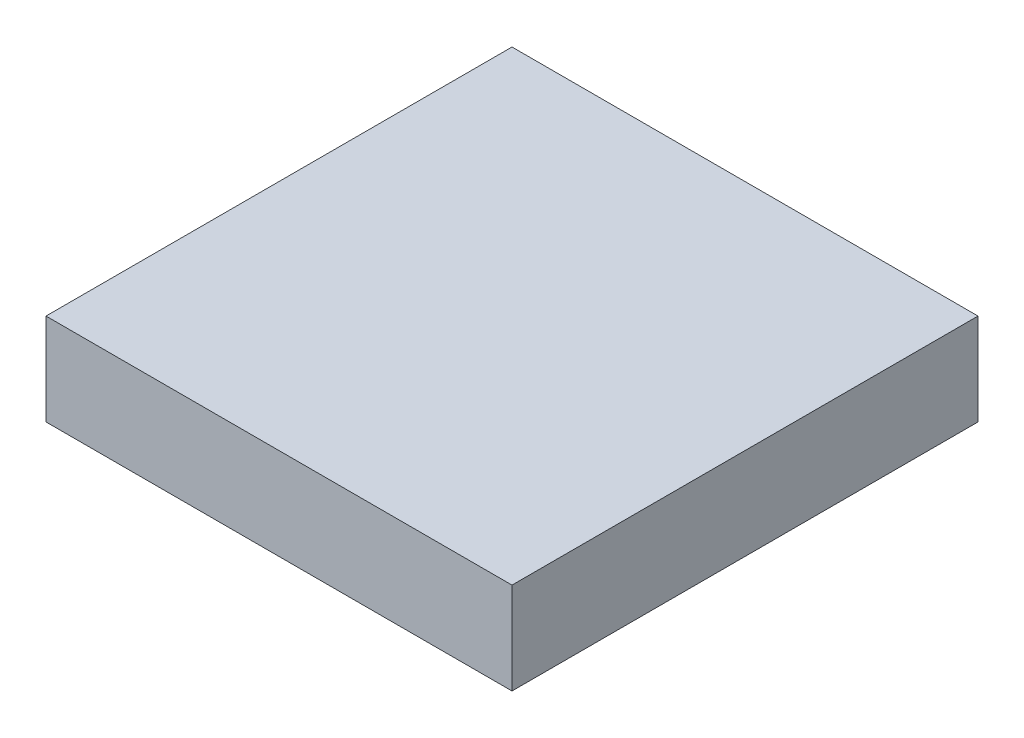
ISO-10303-21;
HEADER;
FILE_DESCRIPTION(('STEP AP214'),'2;1');
FILE_NAME('part.step','',(''),(''),'','','');
FILE_SCHEMA(('AUTOMOTIVE_DESIGN { 1 0 10303 214 1 1 1 1 }'));
ENDSEC;
DATA;
#1=APPLICATION_CONTEXT('core data for automotive mechanical design processes');
#2=APPLICATION_PROTOCOL_DEFINITION('international standard','automotive_design',2000,#1);
#3=PRODUCT_CONTEXT('',#1,'mechanical');
#4=PRODUCT('Part','Part','',(#3));
#5=PRODUCT_RELATED_PRODUCT_CATEGORY('part','',(#4));
#6=PRODUCT_DEFINITION_FORMATION('','',#4);
#7=PRODUCT_DEFINITION_CONTEXT('part definition',#1,'design');
#8=PRODUCT_DEFINITION('design','',#6,#7);
#9=PRODUCT_DEFINITION_SHAPE('','',#8);
#10=(LENGTH_UNIT() NAMED_UNIT(*) SI_UNIT(.MILLI.,.METRE.));
#11=(NAMED_UNIT(*) PLANE_ANGLE_UNIT() SI_UNIT($,.RADIAN.));
#12=(NAMED_UNIT(*) SI_UNIT($,.STERADIAN.) SOLID_ANGLE_UNIT());
#13=UNCERTAINTY_MEASURE_WITH_UNIT(LENGTH_MEASURE(1.E-05),#10,'distance_accuracy_value','');
#14=(GEOMETRIC_REPRESENTATION_CONTEXT(3) GLOBAL_UNCERTAINTY_ASSIGNED_CONTEXT((#13)) GLOBAL_UNIT_ASSIGNED_CONTEXT((#10,
#11,#12)) REPRESENTATION_CONTEXT('',''));
#15=CARTESIAN_POINT('',(0.,0.,0.));
#16=DIRECTION('',(0.,0.,1.));
#17=DIRECTION('',(1.,0.,0.));
#18=AXIS2_PLACEMENT_3D('',#15,#16,#17);
#19=CARTESIAN_POINT('',(12.7,5.,-12.7));
#20=DIRECTION('',(-1.,0.,0.));
#21=DIRECTION('',(0.,0.,1.));
#22=AXIS2_PLACEMENT_3D('',#19,#20,#21);
#23=PLANE('',#22);
#24=DIRECTION('',(0.,0.,-1.));
#25=VECTOR('',#24,1.);
#26=CARTESIAN_POINT('',(12.7,0.,-12.7));
#27=LINE('',#26,#25);
#28=CARTESIAN_POINT('',(12.7,0.,12.7));
#29=VERTEX_POINT('',#28);
#30=CARTESIAN_POINT('',(12.7,0.,-12.7));
#31=VERTEX_POINT('',#30);
#32=EDGE_CURVE('E102',#29,#31,#27,.T.);
#33=ORIENTED_EDGE('',*,*,#32,.T.);
#34=DIRECTION('',(0.,-1.,0.));
#35=VECTOR('',#34,1.);
#36=CARTESIAN_POINT('',(12.7,5.,-12.7));
#37=LINE('',#36,#35);
#38=CARTESIAN_POINT('',(12.7,5.,-12.7));
#39=VERTEX_POINT('',#38);
#40=EDGE_CURVE('E11',#39,#31,#37,.T.);
#41=ORIENTED_EDGE('',*,*,#40,.F.);
#42=DIRECTION('',(0.,0.,-1.));
#43=VECTOR('',#42,1.);
#44=CARTESIAN_POINT('',(12.7,5.,-12.7));
#45=LINE('',#44,#43);
#46=CARTESIAN_POINT('',(12.7,5.,12.7));
#47=VERTEX_POINT('',#46);
#48=EDGE_CURVE('E90',#47,#39,#45,.T.);
#49=ORIENTED_EDGE('',*,*,#48,.F.);
#50=DIRECTION('',(0.,-1.,0.));
#51=VECTOR('',#50,1.);
#52=CARTESIAN_POINT('',(12.7,5.,12.7));
#53=LINE('',#52,#51);
#54=EDGE_CURVE('E98',#47,#29,#53,.T.);
#55=ORIENTED_EDGE('',*,*,#54,.T.);
#56=EDGE_LOOP('',(#33,#41,#49,#55));
#57=FACE_BOUND('',#56,.T.);
#58=ADVANCED_FACE('F39',(#57),#23,.F.);
#59=CARTESIAN_POINT('',(-12.7,5.,-12.7));
#60=DIRECTION('',(0.,0.,1.));
#61=DIRECTION('',(1.,0.,0.));
#62=AXIS2_PLACEMENT_3D('',#59,#60,#61);
#63=PLANE('',#62);
#64=DIRECTION('',(-1.,0.,0.));
#65=VECTOR('',#64,1.);
#66=CARTESIAN_POINT('',(-12.7,0.,-12.7));
#67=LINE('',#66,#65);
#68=CARTESIAN_POINT('',(-12.7,0.,-12.7));
#69=VERTEX_POINT('',#68);
#70=EDGE_CURVE('E94',#31,#69,#67,.T.);
#71=ORIENTED_EDGE('',*,*,#70,.T.);
#72=DIRECTION('',(0.,-1.,0.));
#73=VECTOR('',#72,1.);
#74=CARTESIAN_POINT('',(-12.7,5.,-12.7));
#75=LINE('',#74,#73);
#76=CARTESIAN_POINT('',(-12.7,5.,-12.7));
#77=VERTEX_POINT('',#76);
#78=EDGE_CURVE('E47',#77,#69,#75,.T.);
#79=ORIENTED_EDGE('',*,*,#78,.F.);
#80=DIRECTION('',(-1.,0.,0.));
#81=VECTOR('',#80,1.);
#82=CARTESIAN_POINT('',(-12.7,5.,-12.7));
#83=LINE('',#82,#81);
#84=EDGE_CURVE('E85',#39,#77,#83,.T.);
#85=ORIENTED_EDGE('',*,*,#84,.F.);
#86=ORIENTED_EDGE('',*,*,#40,.T.);
#87=EDGE_LOOP('',(#71,#79,#85,#86));
#88=FACE_BOUND('',#87,.T.);
#89=ADVANCED_FACE('F93',(#88),#63,.F.);
#90=CARTESIAN_POINT('',(-12.7,5.,-12.7));
#91=DIRECTION('',(1.,0.,0.));
#92=DIRECTION('',(0.,0.,-1.));
#93=AXIS2_PLACEMENT_3D('',#90,#91,#92);
#94=PLANE('',#93);
#95=DIRECTION('',(0.,0.,1.));
#96=VECTOR('',#95,1.);
#97=CARTESIAN_POINT('',(-12.7,0.,-12.7));
#98=LINE('',#97,#96);
#99=CARTESIAN_POINT('',(-12.7,0.,12.7));
#100=VERTEX_POINT('',#99);
#101=EDGE_CURVE('E72',#69,#100,#98,.T.);
#102=ORIENTED_EDGE('',*,*,#101,.T.);
#103=DIRECTION('',(0.,-1.,0.));
#104=VECTOR('',#103,1.);
#105=CARTESIAN_POINT('',(-12.7,5.,12.7));
#106=LINE('',#105,#104);
#107=CARTESIAN_POINT('',(-12.7,5.,12.7));
#108=VERTEX_POINT('',#107);
#109=EDGE_CURVE('E95',#108,#100,#106,.T.);
#110=ORIENTED_EDGE('',*,*,#109,.F.);
#111=DIRECTION('',(0.,0.,1.));
#112=VECTOR('',#111,1.);
#113=CARTESIAN_POINT('',(-12.7,5.,-12.7));
#114=LINE('',#113,#112);
#115=EDGE_CURVE('E88',#77,#108,#114,.T.);
#116=ORIENTED_EDGE('',*,*,#115,.F.);
#117=ORIENTED_EDGE('',*,*,#78,.T.);
#118=EDGE_LOOP('',(#102,#110,#116,#117));
#119=FACE_BOUND('',#118,.T.);
#120=ADVANCED_FACE('F96',(#119),#94,.F.);
#121=CARTESIAN_POINT('',(-12.7,5.,12.7));
#122=DIRECTION('',(0.,0.,-1.));
#123=DIRECTION('',(-1.,0.,0.));
#124=AXIS2_PLACEMENT_3D('',#121,#122,#123);
#125=PLANE('',#124);
#126=DIRECTION('',(1.,0.,0.));
#127=VECTOR('',#126,1.);
#128=CARTESIAN_POINT('',(-12.7,0.,12.7));
#129=LINE('',#128,#127);
#130=EDGE_CURVE('E78',#100,#29,#129,.T.);
#131=ORIENTED_EDGE('',*,*,#130,.T.);
#132=ORIENTED_EDGE('',*,*,#54,.F.);
#133=DIRECTION('',(1.,0.,0.));
#134=VECTOR('',#133,1.);
#135=CARTESIAN_POINT('',(-12.7,5.,12.7));
#136=LINE('',#135,#134);
#137=EDGE_CURVE('E55',#108,#47,#136,.T.);
#138=ORIENTED_EDGE('',*,*,#137,.F.);
#139=ORIENTED_EDGE('',*,*,#109,.T.);
#140=EDGE_LOOP('',(#131,#132,#138,#139));
#141=FACE_BOUND('',#140,.T.);
#142=ADVANCED_FACE('F109',(#141),#125,.F.);
#143=CARTESIAN_POINT('',(0.,5.,0.));
#144=DIRECTION('',(0.,1.,0.));
#145=DIRECTION('',(0.,0.,1.));
#146=AXIS2_PLACEMENT_3D('',#143,#144,#145);
#147=PLANE('',#146);
#148=ORIENTED_EDGE('',*,*,#48,.T.);
#149=ORIENTED_EDGE('',*,*,#84,.T.);
#150=ORIENTED_EDGE('',*,*,#115,.T.);
#151=ORIENTED_EDGE('',*,*,#137,.T.);
#152=EDGE_LOOP('',(#148,#149,#150,#151));
#153=FACE_BOUND('',#152,.T.);
#154=ADVANCED_FACE('F86',(#153),#147,.T.);
#155=CARTESIAN_POINT('',(0.,0.,0.));
#156=DIRECTION('',(0.,1.,0.));
#157=DIRECTION('',(0.,0.,1.));
#158=AXIS2_PLACEMENT_3D('',#155,#156,#157);
#159=PLANE('',#158);
#160=ORIENTED_EDGE('',*,*,#32,.F.);
#161=ORIENTED_EDGE('',*,*,#130,.F.);
#162=ORIENTED_EDGE('',*,*,#101,.F.);
#163=ORIENTED_EDGE('',*,*,#70,.F.);
#164=EDGE_LOOP('',(#160,#161,#162,#163));
#165=FACE_BOUND('',#164,.T.);
#166=ADVANCED_FACE('F112',(#165),#159,.F.);
#167=CLOSED_SHELL('',(#58,#89,#120,#142,#154,#166));
#168=MANIFOLD_SOLID_BREP('B2',#167);
#169=ADVANCED_BREP_SHAPE_REPRESENTATION('',(#18,#168),#14);
#170=SHAPE_DEFINITION_REPRESENTATION(#9,#169);
ENDSEC;
END-ISO-10303-21;
